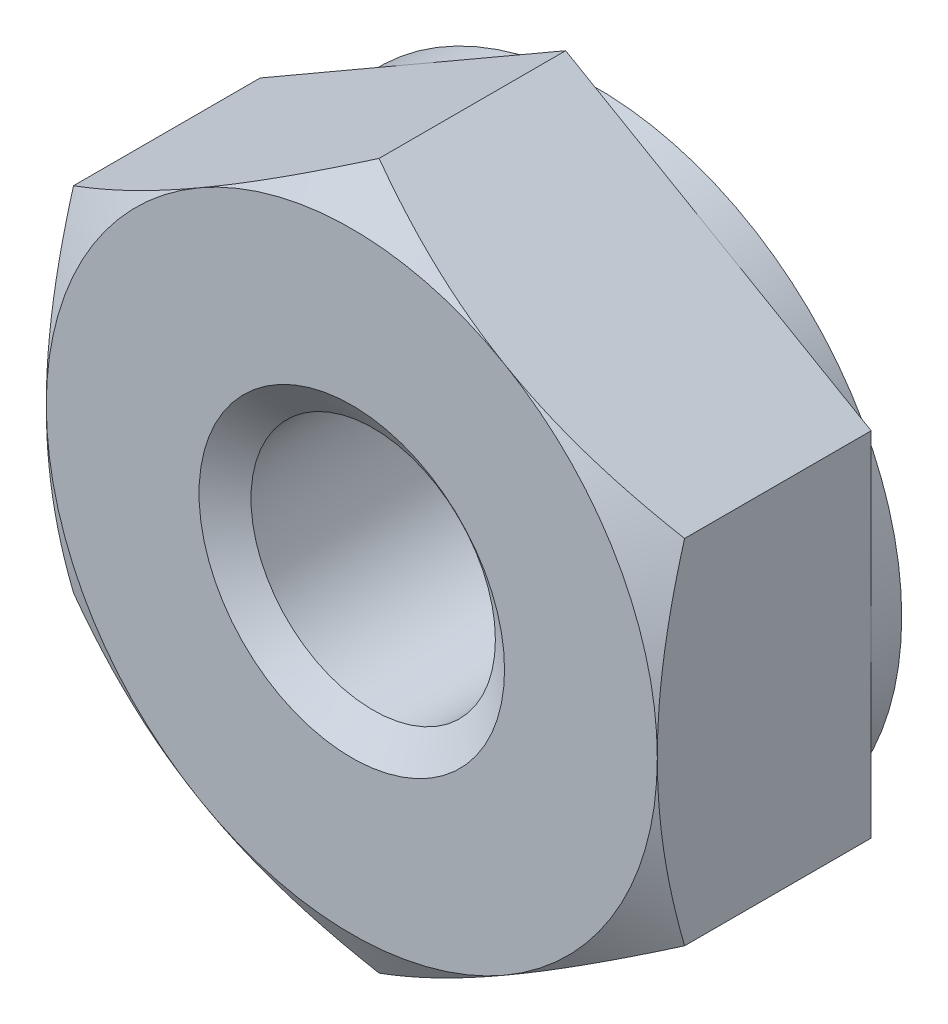
ISO-10303-21;
HEADER;
FILE_DESCRIPTION(('STEP AP214'),'2;1');
FILE_NAME('part.step','',(''),(''),'','','');
FILE_SCHEMA(('AUTOMOTIVE_DESIGN { 1 0 10303 214 1 1 1 1 }'));
ENDSEC;
DATA;
#1=APPLICATION_CONTEXT('core data for automotive mechanical design processes');
#2=APPLICATION_PROTOCOL_DEFINITION('international standard','automotive_design',2000,#1);
#3=PRODUCT_CONTEXT('',#1,'mechanical');
#4=PRODUCT('Part','Part','',(#3));
#5=PRODUCT_RELATED_PRODUCT_CATEGORY('part','',(#4));
#6=PRODUCT_DEFINITION_FORMATION('','',#4);
#7=PRODUCT_DEFINITION_CONTEXT('part definition',#1,'design');
#8=PRODUCT_DEFINITION('design','',#6,#7);
#9=PRODUCT_DEFINITION_SHAPE('','',#8);
#10=(LENGTH_UNIT() NAMED_UNIT(*) SI_UNIT(.MILLI.,.METRE.));
#11=(NAMED_UNIT(*) PLANE_ANGLE_UNIT() SI_UNIT($,.RADIAN.));
#12=(NAMED_UNIT(*) SI_UNIT($,.STERADIAN.) SOLID_ANGLE_UNIT());
#13=UNCERTAINTY_MEASURE_WITH_UNIT(LENGTH_MEASURE(1.E-05),#10,'distance_accuracy_value','');
#14=(GEOMETRIC_REPRESENTATION_CONTEXT(3) GLOBAL_UNCERTAINTY_ASSIGNED_CONTEXT((#13)) GLOBAL_UNIT_ASSIGNED_CONTEXT((#10,
#11,#12)) REPRESENTATION_CONTEXT('',''));
#15=CARTESIAN_POINT('',(0.,0.,0.));
#16=DIRECTION('',(0.,0.,1.));
#17=DIRECTION('',(1.,0.,0.));
#18=AXIS2_PLACEMENT_3D('',#15,#16,#17);
#19=CARTESIAN_POINT('',(0.,0.,-1.6));
#20=DIRECTION('',(0.,0.,1.));
#21=DIRECTION('',(1.,0.,0.));
#22=AXIS2_PLACEMENT_3D('',#19,#20,#21);
#23=CYLINDRICAL_SURFACE('',#22,0.8);
#24=CARTESIAN_POINT('',(0.,0.,-0.140041507641943));
#25=DIRECTION('',(0.,0.,1.));
#26=DIRECTION('',(1.,0.,0.));
#27=AXIS2_PLACEMENT_3D('',#24,#25,#26);
#28=CIRCLE('',#27,0.8);
#29=CARTESIAN_POINT('',(0.8,0.,-0.140041507641943));
#30=VERTEX_POINT('',#29);
#31=EDGE_CURVE('E153',#30,#30,#28,.F.);
#32=ORIENTED_EDGE('',*,*,#31,.F.);
#33=EDGE_LOOP('',(#32));
#34=FACE_BOUND('',#33,.T.);
#35=CARTESIAN_POINT('',(0.,0.,-1.43455849235806));
#36=DIRECTION('',(0.,0.,-1.));
#37=DIRECTION('',(-1.,0.,0.));
#38=AXIS2_PLACEMENT_3D('',#35,#36,#37);
#39=CIRCLE('',#38,0.8);
#40=CARTESIAN_POINT('',(-0.8,0.,-1.43455849235806));
#41=VERTEX_POINT('',#40);
#42=EDGE_CURVE('E41',#41,#41,#39,.F.);
#43=ORIENTED_EDGE('',*,*,#42,.F.);
#44=EDGE_LOOP('',(#43));
#45=FACE_BOUND('',#44,.T.);
#46=ADVANCED_FACE('F36',(#34,#45),#23,.F.);
#47=CARTESIAN_POINT('',(0.,2.30940107675851,-1.6));
#48=DIRECTION('',(-0.500000000000001,0.866025403784438,0.));
#49=DIRECTION('',(-0.866025403784438,-0.500000000000001,0.));
#50=AXIS2_PLACEMENT_3D('',#47,#48,#49);
#51=PLANE('',#50);
#52=DIRECTION('',(0.,0.,1.));
#53=VECTOR('',#52,1.);
#54=CARTESIAN_POINT('',(-2.,1.15470053837925,-1.6));
#55=LINE('',#54,#53);
#56=CARTESIAN_POINT('',(-2.,1.15470053837925,-1.4));
#57=VERTEX_POINT('',#56);
#58=CARTESIAN_POINT('',(-2.,1.15470053837925,-0.178632794954083));
#59=VERTEX_POINT('',#58);
#60=EDGE_CURVE('E294',#57,#59,#55,.T.);
#61=ORIENTED_EDGE('',*,*,#60,.T.);
#62=CARTESIAN_POINT('',(-2.0002,1.15458506832541,-0.178699466620498));
#63=CARTESIAN_POINT('',(-1.91230873709994,1.20532911262018,-0.149389536100679));
#64=CARTESIAN_POINT('',(-1.82365880552641,1.2565111744778,-0.122732851980467));
#65=CARTESIAN_POINT('',(-1.6448237530022,1.35976164019319,-0.0762024910207208));
#66=CARTESIAN_POINT('',(-1.55463545349496,1.41183187919145,-0.0563452763827787));
#67=CARTESIAN_POINT('',(-1.37537661423669,1.51532701829183,-0.0254334640232521));
#68=CARTESIAN_POINT('',(-1.2863336617737,1.56673599086578,-0.0141731515985308));
#69=CARTESIAN_POINT('',(-1.10782860221496,1.66979593505373,-0.000728662594641667));
#70=CARTESIAN_POINT('',(-1.01836714429604,1.72144653186531,0.00146664504653197));
#71=CARTESIAN_POINT('',(-0.851191646451202,1.81796535054794,-0.00309098933064871));
#72=CARTESIAN_POINT('',(-0.773452629734217,1.86284799277603,-0.00872487468701455));
#73=CARTESIAN_POINT('',(-0.618481085463867,1.95232085557725,-0.0265838952608286));
#74=CARTESIAN_POINT('',(-0.541249094258801,1.99691076648954,-0.0388151360234398));
#75=CARTESIAN_POINT('',(-0.385957813517799,2.08656822922816,-0.0693934368676108));
#76=CARTESIAN_POINT('',(-0.30791818689262,2.13162442866767,-0.0878701670657171));
#77=CARTESIAN_POINT('',(-0.153003134307864,2.221064675979,-0.129805518212858));
#78=CARTESIAN_POINT('',(-0.0761257223768789,2.26544987045196,-0.153254280492316));
#79=CARTESIAN_POINT('',(0.000200000000000939,2.30951654681234,-0.1786994666205));
#80=B_SPLINE_CURVE_WITH_KNOTS('',3,(#62,#63,#64,#65,#66,#67,#68,#69,#70,#71,#72,#73,#74,#75,#76,
#77,#78,#79),.UNSPECIFIED.,.F.,.F.,(4,2,2,2,2,2,2,2,4),(0.,0.31703182469561,0.634825876346564,
0.944753967652636,1.25430138000371,1.52387047293094,1.79368946861028,2.06949491027634,
2.34475850821473),.UNSPECIFIED.);
#81=CARTESIAN_POINT('',(-1.,1.73205080756888,0.));
#82=VERTEX_POINT('',#81);
#83=EDGE_CURVE('E60',#59,#82,#80,.T.);
#84=ORIENTED_EDGE('',*,*,#83,.T.);
#85=CARTESIAN_POINT('',(0.,2.30940107675851,-0.178632794954083));
#86=VERTEX_POINT('',#85);
#87=EDGE_CURVE('E167',#82,#86,#80,.T.);
#88=ORIENTED_EDGE('',*,*,#87,.T.);
#89=DIRECTION('',(0.,0.,1.));
#90=VECTOR('',#89,1.);
#91=CARTESIAN_POINT('',(0.,2.30940107675851,-1.6));
#92=LINE('',#91,#90);
#93=CARTESIAN_POINT('',(0.,2.30940107675851,-1.4));
#94=VERTEX_POINT('',#93);
#95=EDGE_CURVE('E282',#94,#86,#92,.T.);
#96=ORIENTED_EDGE('',*,*,#95,.F.);
#97=DIRECTION('',(-0.866025403784438,-0.500000000000001,0.));
#98=VECTOR('',#97,1.);
#99=CARTESIAN_POINT('',(0.,2.30940107675851,-1.4));
#100=LINE('',#99,#98);
#101=CARTESIAN_POINT('',(-1.,1.73205080756888,-1.4));
#102=VERTEX_POINT('',#101);
#103=EDGE_CURVE('E270',#94,#102,#100,.T.);
#104=ORIENTED_EDGE('',*,*,#103,.T.);
#105=EDGE_CURVE('E266',#102,#57,#100,.T.);
#106=ORIENTED_EDGE('',*,*,#105,.T.);
#107=EDGE_LOOP('',(#61,#84,#88,#96,#104,#106));
#108=FACE_BOUND('',#107,.T.);
#109=ADVANCED_FACE('F38',(#108),#51,.T.);
#110=CARTESIAN_POINT('',(2.,1.15470053837925,-1.6));
#111=DIRECTION('',(0.500000000000002,0.866025403784437,0.));
#112=DIRECTION('',(-0.866025403784437,0.500000000000002,0.));
#113=AXIS2_PLACEMENT_3D('',#110,#111,#112);
#114=PLANE('',#113);
#115=ORIENTED_EDGE('',*,*,#95,.T.);
#116=CARTESIAN_POINT('',(-0.00019999999999907,2.30951654681234,-0.1786994666205));
#117=CARTESIAN_POINT('',(0.0876912629000607,2.25877250251758,-0.149389536100681));
#118=CARTESIAN_POINT('',(0.176341194473592,2.20759044065996,-0.122732851980468));
#119=CARTESIAN_POINT('',(0.355176246997803,2.10433997494456,-0.0762024910207221));
#120=CARTESIAN_POINT('',(0.445364546505037,2.05226973594631,-0.0563452763827799));
#121=CARTESIAN_POINT('',(0.624623385763307,1.94877459684592,-0.0254334640232529));
#122=CARTESIAN_POINT('',(0.713666338226305,1.89736562427197,-0.0141731515985313));
#123=CARTESIAN_POINT('',(0.892171397785044,1.79430568008402,-0.000728662594641558));
#124=CARTESIAN_POINT('',(0.981632855703959,1.74265508327244,0.00146664504653239));
#125=CARTESIAN_POINT('',(1.1488083535488,1.64613626458981,-0.00309098933064802));
#126=CARTESIAN_POINT('',(1.22654737026578,1.60125362236172,-0.00872487468701383));
#127=CARTESIAN_POINT('',(1.38151891453613,1.5117807595605,-0.0265838952608277));
#128=CARTESIAN_POINT('',(1.4587509057412,1.46719084864821,-0.0388151360234387));
#129=CARTESIAN_POINT('',(1.6140421864822,1.37753338590959,-0.0693934368676093));
#130=CARTESIAN_POINT('',(1.69208181310738,1.33247718647008,-0.0878701670657154));
#131=CARTESIAN_POINT('',(1.84699686569214,1.24303693915875,-0.129805518212855));
#132=CARTESIAN_POINT('',(1.92387427762312,1.19865174468579,-0.153254280492313));
#133=CARTESIAN_POINT('',(2.0002,1.15458506832541,-0.178699466620497));
#134=B_SPLINE_CURVE_WITH_KNOTS('',3,(#116,#117,#118,#119,#120,#121,#122,#123,#124,#125,#126,
#127,#128,#129,#130,#131,#132,#133),.UNSPECIFIED.,.F.,.F.,(4,2,2,2,2,2,2,2,4),(0.,
0.317031824695611,0.634825876346565,0.944753967652638,1.25430138000371,1.52387047293094,
1.79368946861029,2.06949491027634,2.34475850821473),.UNSPECIFIED.);
#135=CARTESIAN_POINT('',(1.00000000000001,1.73205080756888,0.));
#136=VERTEX_POINT('',#135);
#137=EDGE_CURVE('E164',#86,#136,#134,.T.);
#138=ORIENTED_EDGE('',*,*,#137,.T.);
#139=CARTESIAN_POINT('',(2.,1.15470053837926,-0.178632794954083));
#140=VERTEX_POINT('',#139);
#141=EDGE_CURVE('E147',#136,#140,#134,.T.);
#142=ORIENTED_EDGE('',*,*,#141,.T.);
#143=DIRECTION('',(0.,0.,1.));
#144=VECTOR('',#143,1.);
#145=CARTESIAN_POINT('',(2.,1.15470053837925,-1.6));
#146=LINE('',#145,#144);
#147=CARTESIAN_POINT('',(2.,1.15470053837925,-1.4));
#148=VERTEX_POINT('',#147);
#149=EDGE_CURVE('E163',#148,#140,#146,.T.);
#150=ORIENTED_EDGE('',*,*,#149,.F.);
#151=DIRECTION('',(-0.866025403784437,0.500000000000002,0.));
#152=VECTOR('',#151,1.);
#153=CARTESIAN_POINT('',(2.,1.15470053837925,-1.4));
#154=LINE('',#153,#152);
#155=CARTESIAN_POINT('',(1.00000000000001,1.73205080756887,-1.4));
#156=VERTEX_POINT('',#155);
#157=EDGE_CURVE('E278',#148,#156,#154,.T.);
#158=ORIENTED_EDGE('',*,*,#157,.T.);
#159=EDGE_CURVE('E274',#156,#94,#154,.T.);
#160=ORIENTED_EDGE('',*,*,#159,.T.);
#161=EDGE_LOOP('',(#115,#138,#142,#150,#158,#160));
#162=FACE_BOUND('',#161,.T.);
#163=ADVANCED_FACE('F241',(#162),#114,.T.);
#164=CARTESIAN_POINT('',(2.,1.15470053837925,-1.6));
#165=DIRECTION('',(-1.,0.,0.));
#166=DIRECTION('',(0.,0.,1.));
#167=AXIS2_PLACEMENT_3D('',#164,#165,#166);
#168=PLANE('',#167);
#169=CARTESIAN_POINT('',(2.,-3.06243599497947,-0.957053410620323));
#170=CARTESIAN_POINT('',(2.,-2.97462468513202,-0.914618135332454));
#171=CARTESIAN_POINT('',(2.,-2.88660576044575,-0.872604701878201));
#172=CARTESIAN_POINT('',(2.,-2.71004042392047,-0.789662573424091));
#173=CARTESIAN_POINT('',(2.,-2.62149392396103,-0.748734066234635));
#174=CARTESIAN_POINT('',(2.,-2.44328285836994,-0.667987231477974));
#175=CARTESIAN_POINT('',(2.,-2.3536147942302,-0.628176597351502));
#176=CARTESIAN_POINT('',(2.,-2.17354167395293,-0.550265292890162));
#177=CARTESIAN_POINT('',(2.,-2.08313665652235,-0.512164533422733));
#178=CARTESIAN_POINT('',(2.,-1.90031404940486,-0.4376714603621));
#179=CARTESIAN_POINT('',(2.,-1.80788540023434,-0.401306140224329));
#180=CARTESIAN_POINT('',(2.,-1.62195694964761,-0.331431205515076));
#181=CARTESIAN_POINT('',(2.,-1.52845725096658,-0.297921319609403));
#182=CARTESIAN_POINT('',(2.,-1.34040158791134,-0.234645877627144));
#183=CARTESIAN_POINT('',(2.,-1.24584820361334,-0.204872731943687));
#184=CARTESIAN_POINT('',(2.,-1.05539728812543,-0.150041663725098));
#185=CARTESIAN_POINT('',(2.,-0.959500192348567,-0.124982250068513));
#186=CARTESIAN_POINT('',(2.,-0.76629610705618,-0.0807954522614521));
#187=CARTESIAN_POINT('',(2.,-0.668988749343056,-0.0616696475902394));
#188=CARTESIAN_POINT('',(2.,-0.473201573751664,-0.0306369133490217));
#189=CARTESIAN_POINT('',(2.,-0.37472175483687,-0.0187299901614152));
#190=CARTESIAN_POINT('',(2.,-0.17772521301446,-0.00319166535968482));
#191=CARTESIAN_POINT('',(2.,-0.0792127464695971,0.000492126942978847));
#192=CARTESIAN_POINT('',(2.,0.117733134481542,-0.00059921048284531));
#193=CARTESIAN_POINT('',(2.,0.216166562771041,-0.00537214444610973));
#194=CARTESIAN_POINT('',(2.,0.454297223248122,-0.0267243139120259));
#195=CARTESIAN_POINT('',(2.,0.593620477818536,-0.0474829418890637));
#196=CARTESIAN_POINT('',(2.,0.869689306254768,-0.102199494270678));
#197=CARTESIAN_POINT('',(2.,1.00643164818021,-0.136172948124203));
#198=CARTESIAN_POINT('',(2.,1.21108706615394,-0.19475894565536));
#199=CARTESIAN_POINT('',(2.,1.28004655189501,-0.215857177032565));
#200=CARTESIAN_POINT('',(2.,1.41724192464571,-0.260142084128326));
#201=CARTESIAN_POINT('',(2.,1.48547827495748,-0.283327319381156));
#202=CARTESIAN_POINT('',(2.,1.62094688255353,-0.331302907971968));
#203=CARTESIAN_POINT('',(2.,1.68818262968754,-0.3560834920736));
#204=CARTESIAN_POINT('',(2.,1.82213246587634,-0.407099147686614));
#205=CARTESIAN_POINT('',(2.,1.88884633148565,-0.433334807052325));
#206=CARTESIAN_POINT('',(2.,1.95531849493342,-0.460154503270894));
#207=B_SPLINE_CURVE_WITH_KNOTS('',3,(#169,#170,#171,#172,#173,#174,#175,#176,#177,#178,#179,
#180,#181,#182,#183,#184,#185,#186,#187,#188,#189,#190,#191,#192,#193,#194,#195,#196,#197,#198,
#199,#200,#201,#202,#203,#204,#205,#206),.UNSPECIFIED.,.F.,.F.,(4,2,2,2,2,2,2,2,2,2,2,2,2,2,2,2,
2,2,4),(0.,0.292585896266135,0.585222115299634,0.879532973229948,1.17382847142413,
1.47176772581358,1.76967863724007,2.06697432467463,2.36417580814398,2.66145633652585,
2.95873712774069,3.25411843045681,3.54942304948606,3.97114178181684,4.39335760296179,
4.60967655565109,4.82584733174413,5.04080135347749,5.25584285892498),.UNSPECIFIED.);
#208=CARTESIAN_POINT('',(2.,-1.15470053837926,-0.178632794954083));
#209=VERTEX_POINT('',#208);
#210=CARTESIAN_POINT('',(2.,0.,0.));
#211=VERTEX_POINT('',#210);
#212=EDGE_CURVE('E128',#209,#211,#207,.T.);
#213=ORIENTED_EDGE('',*,*,#212,.F.);
#214=DIRECTION('',(0.,0.,1.));
#215=VECTOR('',#214,1.);
#216=CARTESIAN_POINT('',(2.,-1.15470053837926,-1.6));
#217=LINE('',#216,#215);
#218=CARTESIAN_POINT('',(2.,-1.15470053837926,-1.4));
#219=VERTEX_POINT('',#218);
#220=EDGE_CURVE('E287',#219,#209,#217,.T.);
#221=ORIENTED_EDGE('',*,*,#220,.F.);
#222=DIRECTION('',(0.,-1.,0.));
#223=VECTOR('',#222,1.);
#224=CARTESIAN_POINT('',(2.,1.15470053837925,-1.4));
#225=LINE('',#224,#223);
#226=CARTESIAN_POINT('',(2.,0.,-1.4));
#227=VERTEX_POINT('',#226);
#228=EDGE_CURVE('E279',#227,#219,#225,.T.);
#229=ORIENTED_EDGE('',*,*,#228,.F.);
#230=EDGE_CURVE('E281',#148,#227,#225,.T.);
#231=ORIENTED_EDGE('',*,*,#230,.F.);
#232=ORIENTED_EDGE('',*,*,#149,.T.);
#233=EDGE_CURVE('E141',#211,#140,#207,.T.);
#234=ORIENTED_EDGE('',*,*,#233,.F.);
#235=EDGE_LOOP('',(#213,#221,#229,#231,#232,#234));
#236=FACE_BOUND('',#235,.T.);
#237=ADVANCED_FACE('F160',(#236),#168,.F.);
#238=CARTESIAN_POINT('',(0.,-2.30940107675851,-1.6));
#239=DIRECTION('',(0.500000000000001,-0.866025403784438,0.));
#240=DIRECTION('',(0.866025403784438,0.500000000000001,0.));
#241=AXIS2_PLACEMENT_3D('',#238,#239,#240);
#242=PLANE('',#241);
#243=ORIENTED_EDGE('',*,*,#220,.T.);
#244=CARTESIAN_POINT('',(2.0002,-1.15458506832542,-0.1786994666205));
#245=CARTESIAN_POINT('',(1.91230873709994,-1.20532911262019,-0.149389536100681));
#246=CARTESIAN_POINT('',(1.82365880552641,-1.25651117447781,-0.122732851980469));
#247=CARTESIAN_POINT('',(1.6448237530022,-1.3597616401932,-0.0762024910207237));
#248=CARTESIAN_POINT('',(1.55463545349496,-1.41183187919146,-0.056345276382782));
#249=CARTESIAN_POINT('',(1.37537661423669,-1.51532701829184,-0.0254334640232558));
#250=CARTESIAN_POINT('',(1.28633366177369,-1.56673599086579,-0.0141731515985347));
#251=CARTESIAN_POINT('',(1.10782860221496,-1.66979593505374,-0.000728662594645788));
#252=CARTESIAN_POINT('',(1.01836714429604,-1.72144653186532,0.0014666450465278));
#253=CARTESIAN_POINT('',(0.8511916464512,-1.81796535054795,-0.00309098933065338));
#254=CARTESIAN_POINT('',(0.773452629734215,-1.86284799277604,-0.00872487468701958));
#255=CARTESIAN_POINT('',(0.618481085463865,-1.95232085557726,-0.0265838952608339));
#256=CARTESIAN_POINT('',(0.5412490942588,-1.99691076648955,-0.038815136023445));
#257=CARTESIAN_POINT('',(0.385957813517798,-2.08656822922817,-0.0693934368676158));
#258=CARTESIAN_POINT('',(0.30791818689262,-2.13162442866768,-0.0878701670657221));
#259=CARTESIAN_POINT('',(0.153003134307865,-2.22106467597901,-0.129805518212863));
#260=CARTESIAN_POINT('',(0.0761257223768797,-2.26544987045197,-0.153254280492321));
#261=CARTESIAN_POINT('',(-0.000200000000000286,-2.30951654681235,-0.178699466620505));
#262=B_SPLINE_CURVE_WITH_KNOTS('',3,(#244,#245,#246,#247,#248,#249,#250,#251,#252,#253,#254,
#255,#256,#257,#258,#259,#260,#261),.UNSPECIFIED.,.F.,.F.,(4,2,2,2,2,2,2,2,4),(0.,
0.31703182469561,0.634825876346565,0.944753967652638,1.25430138000372,1.52387047293094,
1.79368946861029,2.06949491027634,2.34475850821473),.UNSPECIFIED.);
#263=CARTESIAN_POINT('',(1.,-1.73205080756888,0.));
#264=VERTEX_POINT('',#263);
#265=EDGE_CURVE('E135',#209,#264,#262,.T.);
#266=ORIENTED_EDGE('',*,*,#265,.T.);
#267=CARTESIAN_POINT('',(0.,-2.30940107675851,-0.178632794954083));
#268=VERTEX_POINT('',#267);
#269=EDGE_CURVE('E175',#264,#268,#262,.T.);
#270=ORIENTED_EDGE('',*,*,#269,.T.);
#271=DIRECTION('',(0.,0.,1.));
#272=VECTOR('',#271,1.);
#273=CARTESIAN_POINT('',(0.,-2.30940107675851,-1.6));
#274=LINE('',#273,#272);
#275=CARTESIAN_POINT('',(0.,-2.30940107675851,-1.4));
#276=VERTEX_POINT('',#275);
#277=EDGE_CURVE('E289',#276,#268,#274,.T.);
#278=ORIENTED_EDGE('',*,*,#277,.F.);
#279=DIRECTION('',(0.866025403784438,0.500000000000001,0.));
#280=VECTOR('',#279,1.);
#281=CARTESIAN_POINT('',(0.,-2.30940107675851,-1.4));
#282=LINE('',#281,#280);
#283=CARTESIAN_POINT('',(1.00000000000001,-1.73205080756888,-1.4));
#284=VERTEX_POINT('',#283);
#285=EDGE_CURVE('E271',#276,#284,#282,.T.);
#286=ORIENTED_EDGE('',*,*,#285,.T.);
#287=EDGE_CURVE('E275',#284,#219,#282,.T.);
#288=ORIENTED_EDGE('',*,*,#287,.T.);
#289=EDGE_LOOP('',(#243,#266,#270,#278,#286,#288));
#290=FACE_BOUND('',#289,.T.);
#291=ADVANCED_FACE('F222',(#290),#242,.T.);
#292=CARTESIAN_POINT('',(-2.,-1.15470053837926,-1.6));
#293=DIRECTION('',(-0.500000000000002,-0.866025403784437,0.));
#294=DIRECTION('',(0.866025403784437,-0.500000000000002,0.));
#295=AXIS2_PLACEMENT_3D('',#292,#293,#294);
#296=PLANE('',#295);
#297=ORIENTED_EDGE('',*,*,#277,.T.);
#298=CARTESIAN_POINT('',(0.000199999999999395,-2.30951654681235,-0.178699466620505));
#299=CARTESIAN_POINT('',(-0.0876912629000611,-2.25877250251759,-0.149389536100686));
#300=CARTESIAN_POINT('',(-0.176341194473593,-2.20759044065997,-0.122732851980473));
#301=CARTESIAN_POINT('',(-0.355176246997804,-2.10433997494457,-0.0762024910207267));
#302=CARTESIAN_POINT('',(-0.445364546505039,-2.05226973594631,-0.0563452763827844));
#303=CARTESIAN_POINT('',(-0.624623385763309,-1.94877459684593,-0.0254334640232571));
#304=CARTESIAN_POINT('',(-0.713666338226307,-1.89736562427198,-0.0141731515985355));
#305=CARTESIAN_POINT('',(-0.892171397785047,-1.79430568008403,-0.000728662594645944));
#306=CARTESIAN_POINT('',(-0.981632855703962,-1.74265508327245,0.00146664504652784));
#307=CARTESIAN_POINT('',(-1.1488083535488,-1.64613626458982,-0.00309098933065254));
#308=CARTESIAN_POINT('',(-1.22654737026579,-1.60125362236173,-0.00872487468701815));
#309=CARTESIAN_POINT('',(-1.38151891453614,-1.51178075956051,-0.0265838952608317));
#310=CARTESIAN_POINT('',(-1.4587509057412,-1.46719084864822,-0.0388151360234426));
#311=CARTESIAN_POINT('',(-1.6140421864822,-1.3775333859096,-0.0693934368676129));
#312=CARTESIAN_POINT('',(-1.69208181310738,-1.33247718647009,-0.0878701670657188));
#313=CARTESIAN_POINT('',(-1.84699686569214,-1.24303693915876,-0.129805518212858));
#314=CARTESIAN_POINT('',(-1.92387427762312,-1.1986517446858,-0.153254280492316));
#315=CARTESIAN_POINT('',(-2.0002,-1.15458506832542,-0.1786994666205));
#316=B_SPLINE_CURVE_WITH_KNOTS('',3,(#298,#299,#300,#301,#302,#303,#304,#305,#306,#307,#308,
#309,#310,#311,#312,#313,#314,#315),.UNSPECIFIED.,.F.,.F.,(4,2,2,2,2,2,2,2,4),(0.,
0.317031824695612,0.634825876346567,0.944753967652641,1.25430138000372,1.52387047293094,
1.79368946861029,2.06949491027634,2.34475850821473),.UNSPECIFIED.);
#317=CARTESIAN_POINT('',(-1.,-1.73205080756888,0.));
#318=VERTEX_POINT('',#317);
#319=EDGE_CURVE('E216',#268,#318,#316,.T.);
#320=ORIENTED_EDGE('',*,*,#319,.T.);
#321=CARTESIAN_POINT('',(-2.,-1.15470053837926,-0.178632794954083));
#322=VERTEX_POINT('',#321);
#323=EDGE_CURVE('E208',#318,#322,#316,.T.);
#324=ORIENTED_EDGE('',*,*,#323,.T.);
#325=DIRECTION('',(0.,0.,1.));
#326=VECTOR('',#325,1.);
#327=CARTESIAN_POINT('',(-2.,-1.15470053837926,-1.6));
#328=LINE('',#327,#326);
#329=CARTESIAN_POINT('',(-2.,-1.15470053837926,-1.4));
#330=VERTEX_POINT('',#329);
#331=EDGE_CURVE('E292',#330,#322,#328,.T.);
#332=ORIENTED_EDGE('',*,*,#331,.F.);
#333=DIRECTION('',(0.866025403784437,-0.500000000000002,0.));
#334=VECTOR('',#333,1.);
#335=CARTESIAN_POINT('',(-2.,-1.15470053837926,-1.4));
#336=LINE('',#335,#334);
#337=CARTESIAN_POINT('',(-1.00000000000001,-1.73205080756888,-1.4));
#338=VERTEX_POINT('',#337);
#339=EDGE_CURVE('E261',#330,#338,#336,.T.);
#340=ORIENTED_EDGE('',*,*,#339,.T.);
#341=EDGE_CURVE('E267',#338,#276,#336,.T.);
#342=ORIENTED_EDGE('',*,*,#341,.T.);
#343=EDGE_LOOP('',(#297,#320,#324,#332,#340,#342));
#344=FACE_BOUND('',#343,.T.);
#345=ADVANCED_FACE('F218',(#344),#296,.T.);
#346=CARTESIAN_POINT('',(-2.,1.15470053837925,-1.6));
#347=DIRECTION('',(-1.,0.,0.));
#348=DIRECTION('',(0.,0.,1.));
#349=AXIS2_PLACEMENT_3D('',#346,#347,#348);
#350=PLANE('',#349);
#351=ORIENTED_EDGE('',*,*,#331,.T.);
#352=CARTESIAN_POINT('',(-2.,-3.06243599497946,-0.957053410620322));
#353=CARTESIAN_POINT('',(-2.,-2.97462468513202,-0.914618135332453));
#354=CARTESIAN_POINT('',(-2.,-2.88660576044575,-0.8726047018782));
#355=CARTESIAN_POINT('',(-2.,-2.71004042392047,-0.78966257342409));
#356=CARTESIAN_POINT('',(-2.,-2.62149392396103,-0.748734066234633));
#357=CARTESIAN_POINT('',(-2.,-2.44328285836993,-0.667987231477973));
#358=CARTESIAN_POINT('',(-2.,-2.3536147942302,-0.628176597351501));
#359=CARTESIAN_POINT('',(-2.,-2.17354167395292,-0.550265292890161));
#360=CARTESIAN_POINT('',(-2.,-2.08313665652235,-0.512164533422732));
#361=CARTESIAN_POINT('',(-2.,-1.90031404940485,-0.437671460362099));
#362=CARTESIAN_POINT('',(-2.,-1.80788540023434,-0.401306140224328));
#363=CARTESIAN_POINT('',(-2.,-1.62195694964761,-0.331431205515075));
#364=CARTESIAN_POINT('',(-2.,-1.52845725096658,-0.297921319609402));
#365=CARTESIAN_POINT('',(-2.,-1.34040158791134,-0.234645877627143));
#366=CARTESIAN_POINT('',(-2.,-1.24584820361334,-0.204872731943686));
#367=CARTESIAN_POINT('',(-2.,-1.05539728812543,-0.150041663725098));
#368=CARTESIAN_POINT('',(-2.,-0.959500192348565,-0.124982250068512));
#369=CARTESIAN_POINT('',(-2.,-0.766296107056177,-0.0807954522614515));
#370=CARTESIAN_POINT('',(-2.,-0.668988749343054,-0.061669647590239));
#371=CARTESIAN_POINT('',(-2.,-0.473201573751662,-0.0306369133490216));
#372=CARTESIAN_POINT('',(-2.,-0.374721754836868,-0.0187299901614152));
#373=CARTESIAN_POINT('',(-2.,-0.177725213014459,-0.00319166535968483));
#374=CARTESIAN_POINT('',(-2.,-0.0792127464695958,0.00049212694297889));
#375=CARTESIAN_POINT('',(-2.,0.117733134481544,-0.000599210482845354));
#376=CARTESIAN_POINT('',(-2.,0.216166562771042,-0.00537214444610992));
#377=CARTESIAN_POINT('',(-2.,0.454297223248123,-0.0267243139120262));
#378=CARTESIAN_POINT('',(-2.,0.593620477818537,-0.047482941889064));
#379=CARTESIAN_POINT('',(-2.,0.86968930625477,-0.102199494270678));
#380=CARTESIAN_POINT('',(-2.,1.00643164818021,-0.136172948124203));
#381=CARTESIAN_POINT('',(-2.,1.21108706615394,-0.194758945655361));
#382=CARTESIAN_POINT('',(-2.,1.28004655189501,-0.215857177032565));
#383=CARTESIAN_POINT('',(-2.,1.41724192464571,-0.260142084128327));
#384=CARTESIAN_POINT('',(-2.,1.48547827495748,-0.283327319381157));
#385=CARTESIAN_POINT('',(-2.,1.62094688255353,-0.331302907971969));
#386=CARTESIAN_POINT('',(-2.,1.68818262968755,-0.356083492073601));
#387=CARTESIAN_POINT('',(-2.,1.82213246587634,-0.407099147686615));
#388=CARTESIAN_POINT('',(-2.,1.88884633148565,-0.433334807052326));
#389=CARTESIAN_POINT('',(-2.,1.95531849493342,-0.460154503270895));
#390=B_SPLINE_CURVE_WITH_KNOTS('',3,(#352,#353,#354,#355,#356,#357,#358,#359,#360,#361,#362,
#363,#364,#365,#366,#367,#368,#369,#370,#371,#372,#373,#374,#375,#376,#377,#378,#379,#380,#381,
#382,#383,#384,#385,#386,#387,#388,#389),.UNSPECIFIED.,.F.,.F.,(4,2,2,2,2,2,2,2,2,2,2,2,2,2,2,2,
2,2,4),(0.,0.292585896266136,0.585222115299634,0.879532973229948,1.17382847142413,
1.47176772581358,1.76967863724007,2.06697432467463,2.36417580814398,2.66145633652585,
2.95873712774069,3.25411843045681,3.54942304948606,3.97114178181684,4.39335760296179,
4.60967655565109,4.82584733174413,5.04080135347749,5.25584285892498),.UNSPECIFIED.);
#391=CARTESIAN_POINT('',(-2.,0.,0.));
#392=VERTEX_POINT('',#391);
#393=EDGE_CURVE('E217',#322,#392,#390,.T.);
#394=ORIENTED_EDGE('',*,*,#393,.T.);
#395=EDGE_CURVE('E152',#392,#59,#390,.T.);
#396=ORIENTED_EDGE('',*,*,#395,.T.);
#397=ORIENTED_EDGE('',*,*,#60,.F.);
#398=DIRECTION('',(0.,-1.,0.));
#399=VECTOR('',#398,1.);
#400=CARTESIAN_POINT('',(-2.,1.15470053837925,-1.4));
#401=LINE('',#400,#399);
#402=CARTESIAN_POINT('',(-2.,0.,-1.4));
#403=VERTEX_POINT('',#402);
#404=EDGE_CURVE('E301',#57,#403,#401,.T.);
#405=ORIENTED_EDGE('',*,*,#404,.T.);
#406=EDGE_CURVE('E299',#403,#330,#401,.T.);
#407=ORIENTED_EDGE('',*,*,#406,.T.);
#408=EDGE_LOOP('',(#351,#394,#396,#397,#405,#407));
#409=FACE_BOUND('',#408,.T.);
#410=ADVANCED_FACE('F221',(#409),#350,.T.);
#411=CARTESIAN_POINT('',(0.,2.30940107675851,0.));
#412=DIRECTION('',(0.,0.,-1.));
#413=DIRECTION('',(-1.,0.,0.));
#414=AXIS2_PLACEMENT_3D('',#411,#412,#413);
#415=PLANE('',#414);
#416=CARTESIAN_POINT('',(0.,0.,0.));
#417=DIRECTION('',(0.,0.,1.));
#418=DIRECTION('',(1.,0.,0.));
#419=AXIS2_PLACEMENT_3D('',#416,#417,#418);
#420=CIRCLE('',#419,1.);
#421=CARTESIAN_POINT('',(1.,0.,0.));
#422=VERTEX_POINT('',#421);
#423=EDGE_CURVE('E304',#422,#422,#420,.T.);
#424=ORIENTED_EDGE('',*,*,#423,.F.);
#425=EDGE_LOOP('',(#424));
#426=FACE_BOUND('',#425,.T.);
#427=CARTESIAN_POINT('',(0.,0.,0.));
#428=DIRECTION('',(0.,0.,-1.));
#429=DIRECTION('',(-1.,0.,0.));
#430=AXIS2_PLACEMENT_3D('',#427,#428,#429);
#431=CIRCLE('',#430,2.);
#432=EDGE_CURVE('E48',#82,#392,#431,.F.);
#433=ORIENTED_EDGE('',*,*,#432,.T.);
#434=EDGE_CURVE('E12',#392,#318,#431,.F.);
#435=ORIENTED_EDGE('',*,*,#434,.T.);
#436=EDGE_CURVE('E46',#318,#264,#431,.F.);
#437=ORIENTED_EDGE('',*,*,#436,.T.);
#438=EDGE_CURVE('E132',#264,#211,#431,.F.);
#439=ORIENTED_EDGE('',*,*,#438,.T.);
#440=CARTESIAN_POINT('',(0.,0.,0.));
#441=DIRECTION('',(0.,0.,1.));
#442=DIRECTION('',(1.,0.,0.));
#443=AXIS2_PLACEMENT_3D('',#440,#441,#442);
#444=CIRCLE('',#443,2.);
#445=EDGE_CURVE('E144',#211,#136,#444,.T.);
#446=ORIENTED_EDGE('',*,*,#445,.T.);
#447=EDGE_CURVE('E158',#136,#82,#431,.F.);
#448=ORIENTED_EDGE('',*,*,#447,.T.);
#449=EDGE_LOOP('',(#433,#435,#437,#439,#446,#448));
#450=FACE_BOUND('',#449,.T.);
#451=ADVANCED_FACE('F156',(#426,#450),#415,.F.);
#452=CARTESIAN_POINT('',(0.,2.30940107675851,-1.6));
#453=DIRECTION('',(0.,0.,-1.));
#454=DIRECTION('',(-1.,0.,0.));
#455=AXIS2_PLACEMENT_3D('',#452,#453,#454);
#456=PLANE('',#455);
#457=CARTESIAN_POINT('',(0.,0.,-1.6));
#458=DIRECTION('',(0.,0.,-1.));
#459=DIRECTION('',(-1.,0.,0.));
#460=AXIS2_PLACEMENT_3D('',#457,#458,#459);
#461=CIRCLE('',#460,1.);
#462=CARTESIAN_POINT('',(-1.,0.,-1.6));
#463=VERTEX_POINT('',#462);
#464=EDGE_CURVE('E305',#463,#463,#461,.F.);
#465=ORIENTED_EDGE('',*,*,#464,.T.);
#466=EDGE_LOOP('',(#465));
#467=FACE_BOUND('',#466,.T.);
#468=CARTESIAN_POINT('',(0.,0.,-1.6));
#469=DIRECTION('',(0.,0.,-1.));
#470=DIRECTION('',(-1.,0.,0.));
#471=AXIS2_PLACEMENT_3D('',#468,#469,#470);
#472=CIRCLE('',#471,2.);
#473=CARTESIAN_POINT('',(-2.,0.,-1.6));
#474=VERTEX_POINT('',#473);
#475=EDGE_CURVE('E285',#474,#474,#472,.F.);
#476=ORIENTED_EDGE('',*,*,#475,.F.);
#477=EDGE_LOOP('',(#476));
#478=FACE_BOUND('',#477,.T.);
#479=ADVANCED_FACE('F231',(#467,#478),#456,.T.);
#480=CARTESIAN_POINT('',(0.,12.3094010767585,-1.4));
#481=DIRECTION('',(0.,0.,-1.));
#482=DIRECTION('',(-1.,0.,0.));
#483=AXIS2_PLACEMENT_3D('',#480,#481,#482);
#484=PLANE('',#483);
#485=ORIENTED_EDGE('',*,*,#230,.T.);
#486=CARTESIAN_POINT('',(0.,0.,-1.4));
#487=DIRECTION('',(0.,0.,1.));
#488=DIRECTION('',(1.,0.,0.));
#489=AXIS2_PLACEMENT_3D('',#486,#487,#488);
#490=CIRCLE('',#489,2.);
#491=EDGE_CURVE('E258',#227,#156,#490,.T.);
#492=ORIENTED_EDGE('',*,*,#491,.T.);
#493=ORIENTED_EDGE('',*,*,#157,.F.);
#494=EDGE_LOOP('',(#485,#492,#493));
#495=FACE_BOUND('',#494,.T.);
#496=ADVANCED_FACE('F248',(#495),#484,.T.);
#497=ORIENTED_EDGE('',*,*,#228,.T.);
#498=ORIENTED_EDGE('',*,*,#287,.F.);
#499=EDGE_CURVE('E263',#284,#227,#490,.T.);
#500=ORIENTED_EDGE('',*,*,#499,.T.);
#501=EDGE_LOOP('',(#497,#498,#500));
#502=FACE_BOUND('',#501,.T.);
#503=ADVANCED_FACE('F451',(#502),#484,.T.);
#504=EDGE_CURVE('E262',#156,#102,#490,.T.);
#505=ORIENTED_EDGE('',*,*,#504,.T.);
#506=ORIENTED_EDGE('',*,*,#103,.F.);
#507=ORIENTED_EDGE('',*,*,#159,.F.);
#508=EDGE_LOOP('',(#505,#506,#507));
#509=FACE_BOUND('',#508,.T.);
#510=ADVANCED_FACE('F442',(#509),#484,.T.);
#511=ORIENTED_EDGE('',*,*,#341,.F.);
#512=EDGE_CURVE('E515',#338,#284,#490,.T.);
#513=ORIENTED_EDGE('',*,*,#512,.T.);
#514=ORIENTED_EDGE('',*,*,#285,.F.);
#515=EDGE_LOOP('',(#511,#513,#514));
#516=FACE_BOUND('',#515,.T.);
#517=ADVANCED_FACE('F433',(#516),#484,.T.);
#518=EDGE_CURVE('E529',#102,#403,#490,.T.);
#519=ORIENTED_EDGE('',*,*,#518,.T.);
#520=ORIENTED_EDGE('',*,*,#404,.F.);
#521=ORIENTED_EDGE('',*,*,#105,.F.);
#522=EDGE_LOOP('',(#519,#520,#521));
#523=FACE_BOUND('',#522,.T.);
#524=ADVANCED_FACE('F417',(#523),#484,.T.);
#525=CARTESIAN_POINT('',(0.,0.,0.));
#526=DIRECTION('',(0.,0.,1.));
#527=DIRECTION('',(1.,0.,0.));
#528=AXIS2_PLACEMENT_3D('',#525,#526,#527);
#529=CYLINDRICAL_SURFACE('',#528,2.);
#530=ORIENTED_EDGE('',*,*,#475,.T.);
#531=EDGE_LOOP('',(#530));
#532=FACE_BOUND('',#531,.T.);
#533=ORIENTED_EDGE('',*,*,#504,.F.);
#534=ORIENTED_EDGE('',*,*,#491,.F.);
#535=ORIENTED_EDGE('',*,*,#499,.F.);
#536=ORIENTED_EDGE('',*,*,#512,.F.);
#537=EDGE_CURVE('E531',#403,#338,#490,.T.);
#538=ORIENTED_EDGE('',*,*,#537,.F.);
#539=ORIENTED_EDGE('',*,*,#518,.F.);
#540=EDGE_LOOP('',(#533,#534,#535,#536,#538,#539));
#541=FACE_BOUND('',#540,.T.);
#542=ADVANCED_FACE('F246',(#532,#541),#529,.T.);
#543=ORIENTED_EDGE('',*,*,#406,.F.);
#544=ORIENTED_EDGE('',*,*,#537,.T.);
#545=ORIENTED_EDGE('',*,*,#339,.F.);
#546=EDGE_LOOP('',(#543,#544,#545));
#547=FACE_BOUND('',#546,.T.);
#548=ADVANCED_FACE('F197',(#547),#484,.T.);
#549=CARTESIAN_POINT('',(0.,0.,0.));
#550=DIRECTION('',(0.,0.,-1.));
#551=DIRECTION('',(-1.,0.,0.));
#552=AXIS2_PLACEMENT_3D('',#549,#550,#551);
#553=CONICAL_SURFACE('',#552,2.,1.0471975511966);
#554=ORIENTED_EDGE('',*,*,#395,.F.);
#555=ORIENTED_EDGE('',*,*,#432,.F.);
#556=ORIENTED_EDGE('',*,*,#83,.F.);
#557=EDGE_LOOP('',(#554,#555,#556));
#558=FACE_BOUND('',#557,.T.);
#559=ADVANCED_FACE('F379',(#558),#553,.T.);
#560=ORIENTED_EDGE('',*,*,#447,.F.);
#561=ORIENTED_EDGE('',*,*,#137,.F.);
#562=ORIENTED_EDGE('',*,*,#87,.F.);
#563=EDGE_LOOP('',(#560,#561,#562));
#564=FACE_BOUND('',#563,.T.);
#565=ADVANCED_FACE('F195',(#564),#553,.T.);
#566=ORIENTED_EDGE('',*,*,#445,.F.);
#567=ORIENTED_EDGE('',*,*,#233,.T.);
#568=ORIENTED_EDGE('',*,*,#141,.F.);
#569=EDGE_LOOP('',(#566,#567,#568));
#570=FACE_BOUND('',#569,.T.);
#571=ADVANCED_FACE('F145',(#570),#553,.T.);
#572=ORIENTED_EDGE('',*,*,#212,.T.);
#573=ORIENTED_EDGE('',*,*,#438,.F.);
#574=ORIENTED_EDGE('',*,*,#265,.F.);
#575=EDGE_LOOP('',(#572,#573,#574));
#576=FACE_BOUND('',#575,.T.);
#577=ADVANCED_FACE('F130',(#576),#553,.T.);
#578=ORIENTED_EDGE('',*,*,#436,.F.);
#579=ORIENTED_EDGE('',*,*,#319,.F.);
#580=ORIENTED_EDGE('',*,*,#269,.F.);
#581=EDGE_LOOP('',(#578,#579,#580));
#582=FACE_BOUND('',#581,.T.);
#583=ADVANCED_FACE('F194',(#582),#553,.T.);
#584=ORIENTED_EDGE('',*,*,#434,.F.);
#585=ORIENTED_EDGE('',*,*,#393,.F.);
#586=ORIENTED_EDGE('',*,*,#323,.F.);
#587=EDGE_LOOP('',(#584,#585,#586));
#588=FACE_BOUND('',#587,.T.);
#589=ADVANCED_FACE('F188',(#588),#553,.T.);
#590=CARTESIAN_POINT('',(0.,0.,-0.154045658406137));
#591=DIRECTION('',(0.,0.,1.));
#592=DIRECTION('',(1.,0.,0.));
#593=AXIS2_PLACEMENT_3D('',#590,#591,#592);
#594=CONICAL_SURFACE('',#593,0.78,0.959931088596878);
#595=ORIENTED_EDGE('',*,*,#423,.T.);
#596=EDGE_LOOP('',(#595));
#597=FACE_BOUND('',#596,.T.);
#598=ORIENTED_EDGE('',*,*,#31,.T.);
#599=EDGE_LOOP('',(#598));
#600=FACE_BOUND('',#599,.T.);
#601=ADVANCED_FACE('F193',(#597,#600),#594,.F.);
#602=CARTESIAN_POINT('',(0.,0.,-1.5746));
#603=DIRECTION('',(0.,0.,-1.));
#604=DIRECTION('',(-1.,0.,0.));
#605=AXIS2_PLACEMENT_3D('',#602,#603,#604);
#606=CONICAL_SURFACE('',#605,1.,0.959931088596879);
#607=CARTESIAN_POINT('',(0.,0.,-1.5746));
#608=DIRECTION('',(0.,0.,1.));
#609=DIRECTION('',(1.,0.,0.));
#610=AXIS2_PLACEMENT_3D('',#607,#608,#609);
#611=CIRCLE('',#610,1.);
#612=CARTESIAN_POINT('',(1.,0.,-1.5746));
#613=VERTEX_POINT('',#612);
#614=EDGE_CURVE('E307',#613,#613,#611,.T.);
#615=ORIENTED_EDGE('',*,*,#614,.F.);
#616=EDGE_LOOP('',(#615));
#617=FACE_BOUND('',#616,.T.);
#618=ORIENTED_EDGE('',*,*,#42,.T.);
#619=EDGE_LOOP('',(#618));
#620=FACE_BOUND('',#619,.T.);
#621=ADVANCED_FACE('F320',(#617,#620),#606,.F.);
#622=CARTESIAN_POINT('',(0.,0.,-25.0375057290932));
#623=DIRECTION('',(0.,0.,1.));
#624=DIRECTION('',(1.,0.,0.));
#625=AXIS2_PLACEMENT_3D('',#622,#623,#624);
#626=CYLINDRICAL_SURFACE('',#625,1.);
#627=ORIENTED_EDGE('',*,*,#464,.F.);
#628=EDGE_LOOP('',(#627));
#629=FACE_BOUND('',#628,.T.);
#630=ORIENTED_EDGE('',*,*,#614,.T.);
#631=EDGE_LOOP('',(#630));
#632=FACE_BOUND('',#631,.T.);
#633=ADVANCED_FACE('F324',(#629,#632),#626,.F.);
#634=CLOSED_SHELL('',(#46,#109,#163,#237,#291,#345,#410,#451,#479,#496,#503,#510,#517,#524,#542,
#548,#559,#565,#571,#577,#583,#589,#601,#621,#633));
#635=MANIFOLD_SOLID_BREP('B2',#634);
#636=ADVANCED_BREP_SHAPE_REPRESENTATION('',(#18,#635),#14);
#637=SHAPE_DEFINITION_REPRESENTATION(#9,#636);
ENDSEC;
END-ISO-10303-21;
